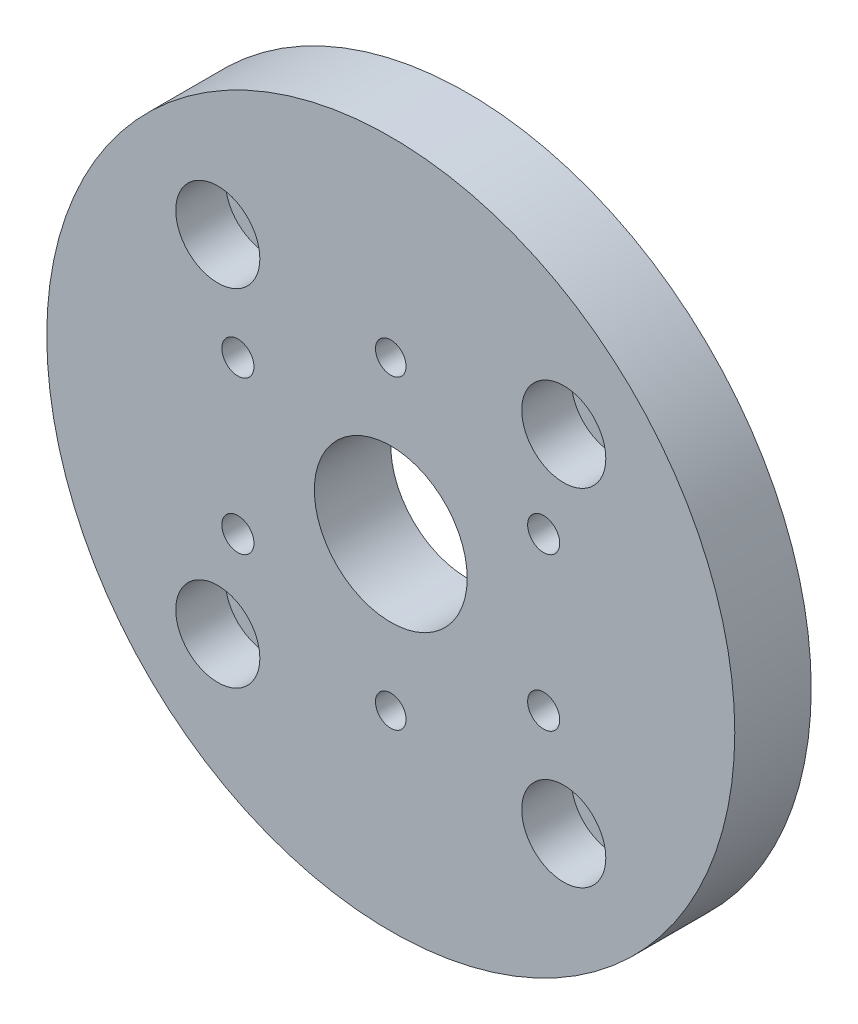
ISO-10303-21;
HEADER;
FILE_DESCRIPTION(('STEP AP214'),'2;1');
FILE_NAME('part.step','',(''),(''),'','','');
FILE_SCHEMA(('AUTOMOTIVE_DESIGN { 1 0 10303 214 1 1 1 1 }'));
ENDSEC;
DATA;
#1=APPLICATION_CONTEXT('core data for automotive mechanical design processes');
#2=APPLICATION_PROTOCOL_DEFINITION('international standard','automotive_design',2000,#1);
#3=PRODUCT_CONTEXT('',#1,'mechanical');
#4=PRODUCT('Part','Part','',(#3));
#5=PRODUCT_RELATED_PRODUCT_CATEGORY('part','',(#4));
#6=PRODUCT_DEFINITION_FORMATION('','',#4);
#7=PRODUCT_DEFINITION_CONTEXT('part definition',#1,'design');
#8=PRODUCT_DEFINITION('design','',#6,#7);
#9=PRODUCT_DEFINITION_SHAPE('','',#8);
#10=(LENGTH_UNIT() NAMED_UNIT(*) SI_UNIT(.MILLI.,.METRE.));
#11=(NAMED_UNIT(*) PLANE_ANGLE_UNIT() SI_UNIT($,.RADIAN.));
#12=(NAMED_UNIT(*) SI_UNIT($,.STERADIAN.) SOLID_ANGLE_UNIT());
#13=UNCERTAINTY_MEASURE_WITH_UNIT(LENGTH_MEASURE(1.E-05),#10,'distance_accuracy_value','');
#14=(GEOMETRIC_REPRESENTATION_CONTEXT(3) GLOBAL_UNCERTAINTY_ASSIGNED_CONTEXT((#13)) GLOBAL_UNIT_ASSIGNED_CONTEXT((#10,
#11,#12)) REPRESENTATION_CONTEXT('',''));
#15=CARTESIAN_POINT('',(0.,0.,0.));
#16=DIRECTION('',(0.,0.,1.));
#17=DIRECTION('',(1.,0.,0.));
#18=AXIS2_PLACEMENT_3D('',#15,#16,#17);
#19=CARTESIAN_POINT('',(22.62741699797,22.62741699797,3.5));
#20=DIRECTION('',(0.,0.,1.));
#21=DIRECTION('',(1.,0.,0.));
#22=AXIS2_PLACEMENT_3D('',#19,#20,#21);
#23=PLANE('',#22);
#24=CARTESIAN_POINT('',(22.62741699797,22.62741699797,3.5));
#25=DIRECTION('',(0.,0.,1.));
#26=DIRECTION('',(1.,0.,0.));
#27=AXIS2_PLACEMENT_3D('',#24,#25,#26);
#28=CIRCLE('',#27,3.3);
#29=CARTESIAN_POINT('',(25.92741699797,22.62741699797,3.5));
#30=VERTEX_POINT('',#29);
#31=EDGE_CURVE('E10',#30,#30,#28,.T.);
#32=ORIENTED_EDGE('',*,*,#31,.F.);
#33=EDGE_LOOP('',(#32));
#34=FACE_BOUND('',#33,.T.);
#35=CARTESIAN_POINT('',(22.62741699797,22.62741699797,3.5));
#36=DIRECTION('',(0.,0.,1.));
#37=DIRECTION('',(1.,0.,0.));
#38=AXIS2_PLACEMENT_3D('',#35,#36,#37);
#39=CIRCLE('',#38,5.5);
#40=CARTESIAN_POINT('',(28.12741699797,22.62741699797,3.5));
#41=VERTEX_POINT('',#40);
#42=EDGE_CURVE('E246',#41,#41,#39,.T.);
#43=ORIENTED_EDGE('',*,*,#42,.T.);
#44=EDGE_LOOP('',(#43));
#45=FACE_BOUND('',#44,.T.);
#46=ADVANCED_FACE('F17',(#34,#45),#23,.T.);
#47=CARTESIAN_POINT('',(-22.62741699797,22.62741699797,3.5));
#48=DIRECTION('',(0.,0.,1.));
#49=DIRECTION('',(1.,0.,0.));
#50=AXIS2_PLACEMENT_3D('',#47,#48,#49);
#51=PLANE('',#50);
#52=CARTESIAN_POINT('',(-22.62741699797,22.62741699797,3.5));
#53=DIRECTION('',(0.,0.,1.));
#54=DIRECTION('',(1.,0.,0.));
#55=AXIS2_PLACEMENT_3D('',#52,#53,#54);
#56=CIRCLE('',#55,3.3);
#57=CARTESIAN_POINT('',(-19.32741699797,22.62741699797,3.5));
#58=VERTEX_POINT('',#57);
#59=EDGE_CURVE('E44',#58,#58,#56,.T.);
#60=ORIENTED_EDGE('',*,*,#59,.F.);
#61=EDGE_LOOP('',(#60));
#62=FACE_BOUND('',#61,.T.);
#63=CARTESIAN_POINT('',(-22.62741699797,22.62741699797,3.5));
#64=DIRECTION('',(0.,0.,1.));
#65=DIRECTION('',(1.,0.,0.));
#66=AXIS2_PLACEMENT_3D('',#63,#64,#65);
#67=CIRCLE('',#66,5.5);
#68=CARTESIAN_POINT('',(-17.12741699797,22.62741699797,3.5));
#69=VERTEX_POINT('',#68);
#70=EDGE_CURVE('E241',#69,#69,#67,.T.);
#71=ORIENTED_EDGE('',*,*,#70,.T.);
#72=EDGE_LOOP('',(#71));
#73=FACE_BOUND('',#72,.T.);
#74=ADVANCED_FACE('F382',(#62,#73),#51,.T.);
#75=CARTESIAN_POINT('',(22.62741699797,-22.62741699797,3.5));
#76=DIRECTION('',(0.,0.,1.));
#77=DIRECTION('',(1.,0.,0.));
#78=AXIS2_PLACEMENT_3D('',#75,#76,#77);
#79=PLANE('',#78);
#80=CARTESIAN_POINT('',(22.62741699797,-22.62741699797,3.5));
#81=DIRECTION('',(0.,0.,1.));
#82=DIRECTION('',(1.,0.,0.));
#83=AXIS2_PLACEMENT_3D('',#80,#81,#82);
#84=CIRCLE('',#83,3.3);
#85=CARTESIAN_POINT('',(25.92741699797,-22.62741699797,3.5));
#86=VERTEX_POINT('',#85);
#87=EDGE_CURVE('E257',#86,#86,#84,.T.);
#88=ORIENTED_EDGE('',*,*,#87,.F.);
#89=EDGE_LOOP('',(#88));
#90=FACE_BOUND('',#89,.T.);
#91=CARTESIAN_POINT('',(22.62741699797,-22.62741699797,3.5));
#92=DIRECTION('',(0.,0.,1.));
#93=DIRECTION('',(1.,0.,0.));
#94=AXIS2_PLACEMENT_3D('',#91,#92,#93);
#95=CIRCLE('',#94,5.5);
#96=CARTESIAN_POINT('',(28.12741699797,-22.62741699797,3.5));
#97=VERTEX_POINT('',#96);
#98=EDGE_CURVE('E207',#97,#97,#95,.T.);
#99=ORIENTED_EDGE('',*,*,#98,.T.);
#100=EDGE_LOOP('',(#99));
#101=FACE_BOUND('',#100,.T.);
#102=ADVANCED_FACE('F378',(#90,#101),#79,.T.);
#103=CARTESIAN_POINT('',(-22.62741699797,-22.62741699797,3.5));
#104=DIRECTION('',(0.,0.,1.));
#105=DIRECTION('',(1.,0.,0.));
#106=AXIS2_PLACEMENT_3D('',#103,#104,#105);
#107=PLANE('',#106);
#108=CARTESIAN_POINT('',(-22.62741699797,-22.62741699797,3.5));
#109=DIRECTION('',(0.,0.,1.));
#110=DIRECTION('',(1.,0.,0.));
#111=AXIS2_PLACEMENT_3D('',#108,#109,#110);
#112=CIRCLE('',#111,3.3);
#113=CARTESIAN_POINT('',(-19.32741699797,-22.62741699797,3.5));
#114=VERTEX_POINT('',#113);
#115=EDGE_CURVE('E250',#114,#114,#112,.T.);
#116=ORIENTED_EDGE('',*,*,#115,.F.);
#117=EDGE_LOOP('',(#116));
#118=FACE_BOUND('',#117,.T.);
#119=CARTESIAN_POINT('',(-22.62741699797,-22.62741699797,3.5));
#120=DIRECTION('',(0.,0.,1.));
#121=DIRECTION('',(1.,0.,0.));
#122=AXIS2_PLACEMENT_3D('',#119,#120,#121);
#123=CIRCLE('',#122,5.5);
#124=CARTESIAN_POINT('',(-17.12741699797,-22.62741699797,3.5));
#125=VERTEX_POINT('',#124);
#126=EDGE_CURVE('E184',#125,#125,#123,.T.);
#127=ORIENTED_EDGE('',*,*,#126,.T.);
#128=EDGE_LOOP('',(#127));
#129=FACE_BOUND('',#128,.T.);
#130=ADVANCED_FACE('F381',(#118,#129),#107,.T.);
#131=CARTESIAN_POINT('',(22.62741699797,22.62741699797,-1.));
#132=DIRECTION('',(0.,0.,1.));
#133=DIRECTION('',(1.,0.,0.));
#134=AXIS2_PLACEMENT_3D('',#131,#132,#133);
#135=CYLINDRICAL_SURFACE('',#134,3.3);
#136=DIRECTION('',(0.,0.,1.));
#137=VECTOR('',#136,1.);
#138=CARTESIAN_POINT('',(25.92741699797,22.62741699797,-1.));
#139=LINE('',#138,#137);
#140=CARTESIAN_POINT('',(25.92741699797,22.62741699797,0.));
#141=VERTEX_POINT('',#140);
#142=EDGE_CURVE('E25',#141,#30,#139,.T.);
#143=ORIENTED_EDGE('',*,*,#142,.F.);
#144=CARTESIAN_POINT('',(22.62741699797,22.62741699797,0.));
#145=DIRECTION('',(0.,0.,1.));
#146=DIRECTION('',(1.,0.,0.));
#147=AXIS2_PLACEMENT_3D('',#144,#145,#146);
#148=CIRCLE('',#147,3.3);
#149=EDGE_CURVE('E223',#141,#141,#148,.T.);
#150=ORIENTED_EDGE('',*,*,#149,.F.);
#151=ORIENTED_EDGE('',*,*,#142,.T.);
#152=ORIENTED_EDGE('',*,*,#31,.T.);
#153=EDGE_LOOP('',(#143,#150,#151,#152));
#154=FACE_BOUND('',#153,.T.);
#155=ADVANCED_FACE('F266',(#154),#135,.F.);
#156=CARTESIAN_POINT('',(-22.62741699797,22.62741699797,-1.));
#157=DIRECTION('',(0.,0.,1.));
#158=DIRECTION('',(1.,0.,0.));
#159=AXIS2_PLACEMENT_3D('',#156,#157,#158);
#160=CYLINDRICAL_SURFACE('',#159,3.3);
#161=DIRECTION('',(0.,0.,1.));
#162=VECTOR('',#161,1.);
#163=CARTESIAN_POINT('',(-19.32741699797,22.62741699797,-1.));
#164=LINE('',#163,#162);
#165=CARTESIAN_POINT('',(-19.32741699797,22.62741699797,0.));
#166=VERTEX_POINT('',#165);
#167=EDGE_CURVE('E260',#166,#58,#164,.T.);
#168=ORIENTED_EDGE('',*,*,#167,.F.);
#169=CARTESIAN_POINT('',(-22.62741699797,22.62741699797,0.));
#170=DIRECTION('',(0.,0.,1.));
#171=DIRECTION('',(1.,0.,0.));
#172=AXIS2_PLACEMENT_3D('',#169,#170,#171);
#173=CIRCLE('',#172,3.3);
#174=EDGE_CURVE('E201',#166,#166,#173,.T.);
#175=ORIENTED_EDGE('',*,*,#174,.F.);
#176=ORIENTED_EDGE('',*,*,#167,.T.);
#177=ORIENTED_EDGE('',*,*,#59,.T.);
#178=EDGE_LOOP('',(#168,#175,#176,#177));
#179=FACE_BOUND('',#178,.T.);
#180=ADVANCED_FACE('F570',(#179),#160,.F.);
#181=CARTESIAN_POINT('',(22.62741699797,-22.62741699797,-1.));
#182=DIRECTION('',(0.,0.,1.));
#183=DIRECTION('',(1.,0.,0.));
#184=AXIS2_PLACEMENT_3D('',#181,#182,#183);
#185=CYLINDRICAL_SURFACE('',#184,3.3);
#186=DIRECTION('',(0.,0.,1.));
#187=VECTOR('',#186,1.);
#188=CARTESIAN_POINT('',(25.92741699797,-22.62741699797,-1.));
#189=LINE('',#188,#187);
#190=CARTESIAN_POINT('',(25.92741699797,-22.62741699797,0.));
#191=VERTEX_POINT('',#190);
#192=EDGE_CURVE('E253',#191,#86,#189,.T.);
#193=ORIENTED_EDGE('',*,*,#192,.F.);
#194=CARTESIAN_POINT('',(22.62741699797,-22.62741699797,0.));
#195=DIRECTION('',(0.,0.,1.));
#196=DIRECTION('',(1.,0.,0.));
#197=AXIS2_PLACEMENT_3D('',#194,#195,#196);
#198=CIRCLE('',#197,3.3);
#199=EDGE_CURVE('E318',#191,#191,#198,.T.);
#200=ORIENTED_EDGE('',*,*,#199,.F.);
#201=ORIENTED_EDGE('',*,*,#192,.T.);
#202=ORIENTED_EDGE('',*,*,#87,.T.);
#203=EDGE_LOOP('',(#193,#200,#201,#202));
#204=FACE_BOUND('',#203,.T.);
#205=ADVANCED_FACE('F375',(#204),#185,.F.);
#206=CARTESIAN_POINT('',(-22.62741699797,-22.62741699797,-1.));
#207=DIRECTION('',(0.,0.,1.));
#208=DIRECTION('',(1.,0.,0.));
#209=AXIS2_PLACEMENT_3D('',#206,#207,#208);
#210=CYLINDRICAL_SURFACE('',#209,3.3);
#211=DIRECTION('',(0.,0.,1.));
#212=VECTOR('',#211,1.);
#213=CARTESIAN_POINT('',(-19.32741699797,-22.62741699797,-1.));
#214=LINE('',#213,#212);
#215=CARTESIAN_POINT('',(-19.32741699797,-22.62741699797,0.));
#216=VERTEX_POINT('',#215);
#217=EDGE_CURVE('E249',#216,#114,#214,.T.);
#218=ORIENTED_EDGE('',*,*,#217,.F.);
#219=CARTESIAN_POINT('',(-22.62741699797,-22.62741699797,0.));
#220=DIRECTION('',(0.,0.,1.));
#221=DIRECTION('',(1.,0.,0.));
#222=AXIS2_PLACEMENT_3D('',#219,#220,#221);
#223=CIRCLE('',#222,3.3);
#224=EDGE_CURVE('E192',#216,#216,#223,.T.);
#225=ORIENTED_EDGE('',*,*,#224,.F.);
#226=ORIENTED_EDGE('',*,*,#217,.T.);
#227=ORIENTED_EDGE('',*,*,#115,.T.);
#228=EDGE_LOOP('',(#218,#225,#226,#227));
#229=FACE_BOUND('',#228,.T.);
#230=ADVANCED_FACE('F560',(#229),#210,.F.);
#231=CARTESIAN_POINT('',(22.62741699797,22.62741699797,3.5));
#232=DIRECTION('',(0.,0.,1.));
#233=DIRECTION('',(1.,0.,0.));
#234=AXIS2_PLACEMENT_3D('',#231,#232,#233);
#235=CYLINDRICAL_SURFACE('',#234,5.5);
#236=DIRECTION('',(0.,0.,1.));
#237=VECTOR('',#236,1.);
#238=CARTESIAN_POINT('',(28.12741699797,22.62741699797,3.5));
#239=LINE('',#238,#237);
#240=CARTESIAN_POINT('',(28.12741699797,22.62741699797,10.));
#241=VERTEX_POINT('',#240);
#242=EDGE_CURVE('E227',#41,#241,#239,.T.);
#243=ORIENTED_EDGE('',*,*,#242,.F.);
#244=ORIENTED_EDGE('',*,*,#42,.F.);
#245=ORIENTED_EDGE('',*,*,#242,.T.);
#246=CARTESIAN_POINT('',(22.62741699797,22.62741699797,10.));
#247=DIRECTION('',(0.,0.,1.));
#248=DIRECTION('',(1.,0.,0.));
#249=AXIS2_PLACEMENT_3D('',#246,#247,#248);
#250=CIRCLE('',#249,5.5);
#251=EDGE_CURVE('E196',#241,#241,#250,.T.);
#252=ORIENTED_EDGE('',*,*,#251,.T.);
#253=EDGE_LOOP('',(#243,#244,#245,#252));
#254=FACE_BOUND('',#253,.T.);
#255=ADVANCED_FACE('F557',(#254),#235,.F.);
#256=CARTESIAN_POINT('',(20.,10.,-1.));
#257=DIRECTION('',(0.,0.,1.));
#258=DIRECTION('',(1.,0.,0.));
#259=AXIS2_PLACEMENT_3D('',#256,#257,#258);
#260=CYLINDRICAL_SURFACE('',#259,2.1);
#261=DIRECTION('',(0.,0.,1.));
#262=VECTOR('',#261,1.);
#263=CARTESIAN_POINT('',(22.1,10.,-1.));
#264=LINE('',#263,#262);
#265=CARTESIAN_POINT('',(22.1,10.,0.));
#266=VERTEX_POINT('',#265);
#267=CARTESIAN_POINT('',(22.1,10.,10.));
#268=VERTEX_POINT('',#267);
#269=EDGE_CURVE('E224',#266,#268,#264,.T.);
#270=ORIENTED_EDGE('',*,*,#269,.F.);
#271=CARTESIAN_POINT('',(20.,10.,0.));
#272=DIRECTION('',(0.,0.,1.));
#273=DIRECTION('',(1.,0.,0.));
#274=AXIS2_PLACEMENT_3D('',#271,#272,#273);
#275=CIRCLE('',#274,2.1);
#276=EDGE_CURVE('E215',#266,#266,#275,.T.);
#277=ORIENTED_EDGE('',*,*,#276,.F.);
#278=ORIENTED_EDGE('',*,*,#269,.T.);
#279=CARTESIAN_POINT('',(20.,10.,10.));
#280=DIRECTION('',(0.,0.,1.));
#281=DIRECTION('',(1.,0.,0.));
#282=AXIS2_PLACEMENT_3D('',#279,#280,#281);
#283=CIRCLE('',#282,2.1);
#284=EDGE_CURVE('E304',#268,#268,#283,.T.);
#285=ORIENTED_EDGE('',*,*,#284,.T.);
#286=EDGE_LOOP('',(#270,#277,#278,#285));
#287=FACE_BOUND('',#286,.T.);
#288=ADVANCED_FACE('F329',(#287),#260,.F.);
#289=CARTESIAN_POINT('',(0.,20.,-1.));
#290=DIRECTION('',(0.,0.,1.));
#291=DIRECTION('',(1.,0.,0.));
#292=AXIS2_PLACEMENT_3D('',#289,#290,#291);
#293=CYLINDRICAL_SURFACE('',#292,2.);
#294=DIRECTION('',(0.,0.,1.));
#295=VECTOR('',#294,1.);
#296=CARTESIAN_POINT('',(2.,20.,-1.));
#297=LINE('',#296,#295);
#298=CARTESIAN_POINT('',(2.,20.,0.));
#299=VERTEX_POINT('',#298);
#300=CARTESIAN_POINT('',(2.,20.,10.));
#301=VERTEX_POINT('',#300);
#302=EDGE_CURVE('E228',#299,#301,#297,.T.);
#303=ORIENTED_EDGE('',*,*,#302,.F.);
#304=CARTESIAN_POINT('',(0.,20.,0.));
#305=DIRECTION('',(0.,0.,1.));
#306=DIRECTION('',(1.,0.,0.));
#307=AXIS2_PLACEMENT_3D('',#304,#305,#306);
#308=CIRCLE('',#307,2.);
#309=EDGE_CURVE('E219',#299,#299,#308,.T.);
#310=ORIENTED_EDGE('',*,*,#309,.F.);
#311=ORIENTED_EDGE('',*,*,#302,.T.);
#312=CARTESIAN_POINT('',(0.,20.,10.));
#313=DIRECTION('',(0.,0.,1.));
#314=DIRECTION('',(1.,0.,0.));
#315=AXIS2_PLACEMENT_3D('',#312,#313,#314);
#316=CIRCLE('',#315,2.);
#317=EDGE_CURVE('E309',#301,#301,#316,.T.);
#318=ORIENTED_EDGE('',*,*,#317,.T.);
#319=EDGE_LOOP('',(#303,#310,#311,#318));
#320=FACE_BOUND('',#319,.T.);
#321=ADVANCED_FACE('F565',(#320),#293,.F.);
#322=CARTESIAN_POINT('',(-22.62741699797,22.62741699797,3.5));
#323=DIRECTION('',(0.,0.,1.));
#324=DIRECTION('',(1.,0.,0.));
#325=AXIS2_PLACEMENT_3D('',#322,#323,#324);
#326=CYLINDRICAL_SURFACE('',#325,5.5);
#327=DIRECTION('',(0.,0.,1.));
#328=VECTOR('',#327,1.);
#329=CARTESIAN_POINT('',(-17.12741699797,22.62741699797,3.5));
#330=LINE('',#329,#328);
#331=CARTESIAN_POINT('',(-17.12741699797,22.62741699797,10.));
#332=VERTEX_POINT('',#331);
#333=EDGE_CURVE('E238',#69,#332,#330,.T.);
#334=ORIENTED_EDGE('',*,*,#333,.F.);
#335=ORIENTED_EDGE('',*,*,#70,.F.);
#336=ORIENTED_EDGE('',*,*,#333,.T.);
#337=CARTESIAN_POINT('',(-22.62741699797,22.62741699797,10.));
#338=DIRECTION('',(0.,0.,1.));
#339=DIRECTION('',(1.,0.,0.));
#340=AXIS2_PLACEMENT_3D('',#337,#338,#339);
#341=CIRCLE('',#340,5.5);
#342=EDGE_CURVE('E305',#332,#332,#341,.T.);
#343=ORIENTED_EDGE('',*,*,#342,.T.);
#344=EDGE_LOOP('',(#334,#335,#336,#343));
#345=FACE_BOUND('',#344,.T.);
#346=ADVANCED_FACE('F545',(#345),#326,.F.);
#347=CARTESIAN_POINT('',(-20.,10.,-1.));
#348=DIRECTION('',(0.,0.,1.));
#349=DIRECTION('',(1.,0.,0.));
#350=AXIS2_PLACEMENT_3D('',#347,#348,#349);
#351=CYLINDRICAL_SURFACE('',#350,2.1);
#352=DIRECTION('',(0.,0.,1.));
#353=VECTOR('',#352,1.);
#354=CARTESIAN_POINT('',(-17.9,10.,-1.));
#355=LINE('',#354,#353);
#356=CARTESIAN_POINT('',(-17.9,10.,0.));
#357=VERTEX_POINT('',#356);
#358=CARTESIAN_POINT('',(-17.9,10.,10.));
#359=VERTEX_POINT('',#358);
#360=EDGE_CURVE('E206',#357,#359,#355,.T.);
#361=ORIENTED_EDGE('',*,*,#360,.F.);
#362=CARTESIAN_POINT('',(-20.,10.,0.));
#363=DIRECTION('',(0.,0.,1.));
#364=DIRECTION('',(1.,0.,0.));
#365=AXIS2_PLACEMENT_3D('',#362,#363,#364);
#366=CIRCLE('',#365,2.1);
#367=EDGE_CURVE('E197',#357,#357,#366,.T.);
#368=ORIENTED_EDGE('',*,*,#367,.F.);
#369=ORIENTED_EDGE('',*,*,#360,.T.);
#370=CARTESIAN_POINT('',(-20.,10.,10.));
#371=DIRECTION('',(0.,0.,1.));
#372=DIRECTION('',(1.,0.,0.));
#373=AXIS2_PLACEMENT_3D('',#370,#371,#372);
#374=CIRCLE('',#373,2.1);
#375=EDGE_CURVE('E276',#359,#359,#374,.T.);
#376=ORIENTED_EDGE('',*,*,#375,.T.);
#377=EDGE_LOOP('',(#361,#368,#369,#376));
#378=FACE_BOUND('',#377,.T.);
#379=ADVANCED_FACE('F527',(#378),#351,.F.);
#380=CARTESIAN_POINT('',(20.,-10.,-1.));
#381=DIRECTION('',(0.,0.,1.));
#382=DIRECTION('',(1.,0.,0.));
#383=AXIS2_PLACEMENT_3D('',#380,#381,#382);
#384=CYLINDRICAL_SURFACE('',#383,2.1);
#385=DIRECTION('',(0.,0.,1.));
#386=VECTOR('',#385,1.);
#387=CARTESIAN_POINT('',(22.1,-10.,-1.));
#388=LINE('',#387,#386);
#389=CARTESIAN_POINT('',(22.1,-10.,0.));
#390=VERTEX_POINT('',#389);
#391=CARTESIAN_POINT('',(22.1,-10.,10.));
#392=VERTEX_POINT('',#391);
#393=EDGE_CURVE('E203',#390,#392,#388,.T.);
#394=ORIENTED_EDGE('',*,*,#393,.F.);
#395=CARTESIAN_POINT('',(20.,-10.,0.));
#396=DIRECTION('',(0.,0.,1.));
#397=DIRECTION('',(1.,0.,0.));
#398=AXIS2_PLACEMENT_3D('',#395,#396,#397);
#399=CIRCLE('',#398,2.1);
#400=EDGE_CURVE('E202',#390,#390,#399,.T.);
#401=ORIENTED_EDGE('',*,*,#400,.F.);
#402=ORIENTED_EDGE('',*,*,#393,.T.);
#403=CARTESIAN_POINT('',(20.,-10.,10.));
#404=DIRECTION('',(0.,0.,1.));
#405=DIRECTION('',(1.,0.,0.));
#406=AXIS2_PLACEMENT_3D('',#403,#404,#405);
#407=CIRCLE('',#406,2.1);
#408=EDGE_CURVE('E291',#392,#392,#407,.T.);
#409=ORIENTED_EDGE('',*,*,#408,.T.);
#410=EDGE_LOOP('',(#394,#401,#402,#409));
#411=FACE_BOUND('',#410,.T.);
#412=ADVANCED_FACE('F536',(#411),#384,.F.);
#413=CARTESIAN_POINT('',(22.62741699797,-22.62741699797,3.5));
#414=DIRECTION('',(0.,0.,1.));
#415=DIRECTION('',(1.,0.,0.));
#416=AXIS2_PLACEMENT_3D('',#413,#414,#415);
#417=CYLINDRICAL_SURFACE('',#416,5.5);
#418=DIRECTION('',(0.,0.,1.));
#419=VECTOR('',#418,1.);
#420=CARTESIAN_POINT('',(28.12741699797,-22.62741699797,3.5));
#421=LINE('',#420,#419);
#422=CARTESIAN_POINT('',(28.12741699797,-22.62741699797,10.));
#423=VERTEX_POINT('',#422);
#424=EDGE_CURVE('E181',#97,#423,#421,.T.);
#425=ORIENTED_EDGE('',*,*,#424,.F.);
#426=ORIENTED_EDGE('',*,*,#98,.F.);
#427=ORIENTED_EDGE('',*,*,#424,.T.);
#428=CARTESIAN_POINT('',(22.62741699797,-22.62741699797,10.));
#429=DIRECTION('',(0.,0.,1.));
#430=DIRECTION('',(1.,0.,0.));
#431=AXIS2_PLACEMENT_3D('',#428,#429,#430);
#432=CIRCLE('',#431,5.5);
#433=EDGE_CURVE('E287',#423,#423,#432,.T.);
#434=ORIENTED_EDGE('',*,*,#433,.T.);
#435=EDGE_LOOP('',(#425,#426,#427,#434));
#436=FACE_BOUND('',#435,.T.);
#437=ADVANCED_FACE('F387',(#436),#417,.F.);
#438=CARTESIAN_POINT('',(0.,0.,-1.));
#439=DIRECTION('',(0.,0.,1.));
#440=DIRECTION('',(1.,0.,0.));
#441=AXIS2_PLACEMENT_3D('',#438,#439,#440);
#442=CYLINDRICAL_SURFACE('',#441,10.);
#443=DIRECTION('',(0.,0.,1.));
#444=VECTOR('',#443,1.);
#445=CARTESIAN_POINT('',(10.,0.,-1.));
#446=LINE('',#445,#444);
#447=CARTESIAN_POINT('',(10.,0.,0.));
#448=VERTEX_POINT('',#447);
#449=CARTESIAN_POINT('',(10.,0.,10.));
#450=VERTEX_POINT('',#449);
#451=EDGE_CURVE('E173',#448,#450,#446,.T.);
#452=ORIENTED_EDGE('',*,*,#451,.F.);
#453=CARTESIAN_POINT('',(0.,0.,0.));
#454=DIRECTION('',(0.,0.,1.));
#455=DIRECTION('',(1.,0.,0.));
#456=AXIS2_PLACEMENT_3D('',#453,#454,#455);
#457=CIRCLE('',#456,10.);
#458=EDGE_CURVE('E211',#448,#448,#457,.T.);
#459=ORIENTED_EDGE('',*,*,#458,.F.);
#460=ORIENTED_EDGE('',*,*,#451,.T.);
#461=CARTESIAN_POINT('',(0.,0.,10.));
#462=DIRECTION('',(0.,0.,1.));
#463=DIRECTION('',(1.,0.,0.));
#464=AXIS2_PLACEMENT_3D('',#461,#462,#463);
#465=CIRCLE('',#464,10.);
#466=EDGE_CURVE('E292',#450,#450,#465,.T.);
#467=ORIENTED_EDGE('',*,*,#466,.T.);
#468=EDGE_LOOP('',(#452,#459,#460,#467));
#469=FACE_BOUND('',#468,.T.);
#470=ADVANCED_FACE('F543',(#469),#442,.F.);
#471=CARTESIAN_POINT('',(-20.,-10.,-1.));
#472=DIRECTION('',(0.,0.,1.));
#473=DIRECTION('',(1.,0.,0.));
#474=AXIS2_PLACEMENT_3D('',#471,#472,#473);
#475=CYLINDRICAL_SURFACE('',#474,2.1);
#476=DIRECTION('',(0.,0.,1.));
#477=VECTOR('',#476,1.);
#478=CARTESIAN_POINT('',(-17.9,-10.,-1.));
#479=LINE('',#478,#477);
#480=CARTESIAN_POINT('',(-17.9,-10.,0.));
#481=VERTEX_POINT('',#480);
#482=CARTESIAN_POINT('',(-17.9,-10.,10.));
#483=VERTEX_POINT('',#482);
#484=EDGE_CURVE('E166',#481,#483,#479,.T.);
#485=ORIENTED_EDGE('',*,*,#484,.F.);
#486=CARTESIAN_POINT('',(-20.,-10.,0.));
#487=DIRECTION('',(0.,0.,1.));
#488=DIRECTION('',(1.,0.,0.));
#489=AXIS2_PLACEMENT_3D('',#486,#487,#488);
#490=CIRCLE('',#489,2.1);
#491=EDGE_CURVE('E171',#481,#481,#490,.T.);
#492=ORIENTED_EDGE('',*,*,#491,.F.);
#493=ORIENTED_EDGE('',*,*,#484,.T.);
#494=CARTESIAN_POINT('',(-20.,-10.,10.));
#495=DIRECTION('',(0.,0.,1.));
#496=DIRECTION('',(1.,0.,0.));
#497=AXIS2_PLACEMENT_3D('',#494,#495,#496);
#498=CIRCLE('',#497,2.1);
#499=EDGE_CURVE('E169',#483,#483,#498,.T.);
#500=ORIENTED_EDGE('',*,*,#499,.T.);
#501=EDGE_LOOP('',(#485,#492,#493,#500));
#502=FACE_BOUND('',#501,.T.);
#503=ADVANCED_FACE('F167',(#502),#475,.F.);
#504=CARTESIAN_POINT('',(0.,-20.,-1.));
#505=DIRECTION('',(0.,0.,1.));
#506=DIRECTION('',(1.,0.,0.));
#507=AXIS2_PLACEMENT_3D('',#504,#505,#506);
#508=CYLINDRICAL_SURFACE('',#507,2.);
#509=DIRECTION('',(0.,0.,1.));
#510=VECTOR('',#509,1.);
#511=CARTESIAN_POINT('',(2.,-20.,-1.));
#512=LINE('',#511,#510);
#513=CARTESIAN_POINT('',(2.,-20.,0.));
#514=VERTEX_POINT('',#513);
#515=CARTESIAN_POINT('',(2.,-20.,10.));
#516=VERTEX_POINT('',#515);
#517=EDGE_CURVE('E174',#514,#516,#512,.T.);
#518=ORIENTED_EDGE('',*,*,#517,.F.);
#519=CARTESIAN_POINT('',(0.,-20.,0.));
#520=DIRECTION('',(0.,0.,1.));
#521=DIRECTION('',(1.,0.,0.));
#522=AXIS2_PLACEMENT_3D('',#519,#520,#521);
#523=CIRCLE('',#522,2.);
#524=EDGE_CURVE('E191',#514,#514,#523,.T.);
#525=ORIENTED_EDGE('',*,*,#524,.F.);
#526=ORIENTED_EDGE('',*,*,#517,.T.);
#527=CARTESIAN_POINT('',(0.,-20.,10.));
#528=DIRECTION('',(0.,0.,1.));
#529=DIRECTION('',(1.,0.,0.));
#530=AXIS2_PLACEMENT_3D('',#527,#528,#529);
#531=CIRCLE('',#530,2.);
#532=EDGE_CURVE('E283',#516,#516,#531,.T.);
#533=ORIENTED_EDGE('',*,*,#532,.T.);
#534=EDGE_LOOP('',(#518,#525,#526,#533));
#535=FACE_BOUND('',#534,.T.);
#536=ADVANCED_FACE('F584',(#535),#508,.F.);
#537=CARTESIAN_POINT('',(-22.62741699797,-22.62741699797,3.5));
#538=DIRECTION('',(0.,0.,1.));
#539=DIRECTION('',(1.,0.,0.));
#540=AXIS2_PLACEMENT_3D('',#537,#538,#539);
#541=CYLINDRICAL_SURFACE('',#540,5.5);
#542=DIRECTION('',(0.,0.,1.));
#543=VECTOR('',#542,1.);
#544=CARTESIAN_POINT('',(-17.12741699797,-22.62741699797,3.5));
#545=LINE('',#544,#543);
#546=CARTESIAN_POINT('',(-17.12741699797,-22.62741699797,10.));
#547=VERTEX_POINT('',#546);
#548=EDGE_CURVE('E229',#125,#547,#545,.T.);
#549=ORIENTED_EDGE('',*,*,#548,.F.);
#550=ORIENTED_EDGE('',*,*,#126,.F.);
#551=ORIENTED_EDGE('',*,*,#548,.T.);
#552=CARTESIAN_POINT('',(-22.62741699797,-22.62741699797,10.));
#553=DIRECTION('',(0.,0.,1.));
#554=DIRECTION('',(1.,0.,0.));
#555=AXIS2_PLACEMENT_3D('',#552,#553,#554);
#556=CIRCLE('',#555,5.5);
#557=EDGE_CURVE('E281',#547,#547,#556,.T.);
#558=ORIENTED_EDGE('',*,*,#557,.T.);
#559=EDGE_LOOP('',(#549,#550,#551,#558));
#560=FACE_BOUND('',#559,.T.);
#561=ADVANCED_FACE('F532',(#560),#541,.F.);
#562=CARTESIAN_POINT('',(0.,0.,0.));
#563=DIRECTION('',(0.,0.,1.));
#564=DIRECTION('',(1.,0.,0.));
#565=AXIS2_PLACEMENT_3D('',#562,#563,#564);
#566=PLANE('',#565);
#567=ORIENTED_EDGE('',*,*,#149,.T.);
#568=EDGE_LOOP('',(#567));
#569=FACE_BOUND('',#568,.T.);
#570=ORIENTED_EDGE('',*,*,#309,.T.);
#571=EDGE_LOOP('',(#570));
#572=FACE_BOUND('',#571,.T.);
#573=ORIENTED_EDGE('',*,*,#276,.T.);
#574=EDGE_LOOP('',(#573));
#575=FACE_BOUND('',#574,.T.);
#576=ORIENTED_EDGE('',*,*,#458,.T.);
#577=EDGE_LOOP('',(#576));
#578=FACE_BOUND('',#577,.T.);
#579=ORIENTED_EDGE('',*,*,#174,.T.);
#580=EDGE_LOOP('',(#579));
#581=FACE_BOUND('',#580,.T.);
#582=ORIENTED_EDGE('',*,*,#367,.T.);
#583=EDGE_LOOP('',(#582));
#584=FACE_BOUND('',#583,.T.);
#585=ORIENTED_EDGE('',*,*,#400,.T.);
#586=EDGE_LOOP('',(#585));
#587=FACE_BOUND('',#586,.T.);
#588=ORIENTED_EDGE('',*,*,#199,.T.);
#589=EDGE_LOOP('',(#588));
#590=FACE_BOUND('',#589,.T.);
#591=ORIENTED_EDGE('',*,*,#524,.T.);
#592=EDGE_LOOP('',(#591));
#593=FACE_BOUND('',#592,.T.);
#594=ORIENTED_EDGE('',*,*,#491,.T.);
#595=EDGE_LOOP('',(#594));
#596=FACE_BOUND('',#595,.T.);
#597=ORIENTED_EDGE('',*,*,#224,.T.);
#598=EDGE_LOOP('',(#597));
#599=FACE_BOUND('',#598,.T.);
#600=CARTESIAN_POINT('',(0.,0.,0.));
#601=DIRECTION('',(0.,0.,1.));
#602=DIRECTION('',(1.,0.,0.));
#603=AXIS2_PLACEMENT_3D('',#600,#601,#602);
#604=CIRCLE('',#603,45.);
#605=CARTESIAN_POINT('',(45.,0.,0.));
#606=VERTEX_POINT('',#605);
#607=EDGE_CURVE('E278',#606,#606,#604,.T.);
#608=ORIENTED_EDGE('',*,*,#607,.F.);
#609=EDGE_LOOP('',(#608));
#610=FACE_BOUND('',#609,.T.);
#611=ADVANCED_FACE('F269',(#569,#572,#575,#578,#581,#584,#587,#590,#593,#596,#599,#610),#566,.F.);
#612=CARTESIAN_POINT('',(0.,0.,10.));
#613=DIRECTION('',(0.,0.,1.));
#614=DIRECTION('',(1.,0.,0.));
#615=AXIS2_PLACEMENT_3D('',#612,#613,#614);
#616=PLANE('',#615);
#617=ORIENTED_EDGE('',*,*,#251,.F.);
#618=EDGE_LOOP('',(#617));
#619=FACE_BOUND('',#618,.T.);
#620=ORIENTED_EDGE('',*,*,#284,.F.);
#621=EDGE_LOOP('',(#620));
#622=FACE_BOUND('',#621,.T.);
#623=ORIENTED_EDGE('',*,*,#317,.F.);
#624=EDGE_LOOP('',(#623));
#625=FACE_BOUND('',#624,.T.);
#626=ORIENTED_EDGE('',*,*,#342,.F.);
#627=EDGE_LOOP('',(#626));
#628=FACE_BOUND('',#627,.T.);
#629=ORIENTED_EDGE('',*,*,#375,.F.);
#630=EDGE_LOOP('',(#629));
#631=FACE_BOUND('',#630,.T.);
#632=ORIENTED_EDGE('',*,*,#408,.F.);
#633=EDGE_LOOP('',(#632));
#634=FACE_BOUND('',#633,.T.);
#635=ORIENTED_EDGE('',*,*,#433,.F.);
#636=EDGE_LOOP('',(#635));
#637=FACE_BOUND('',#636,.T.);
#638=ORIENTED_EDGE('',*,*,#466,.F.);
#639=EDGE_LOOP('',(#638));
#640=FACE_BOUND('',#639,.T.);
#641=ORIENTED_EDGE('',*,*,#499,.F.);
#642=EDGE_LOOP('',(#641));
#643=FACE_BOUND('',#642,.T.);
#644=ORIENTED_EDGE('',*,*,#532,.F.);
#645=EDGE_LOOP('',(#644));
#646=FACE_BOUND('',#645,.T.);
#647=ORIENTED_EDGE('',*,*,#557,.F.);
#648=EDGE_LOOP('',(#647));
#649=FACE_BOUND('',#648,.T.);
#650=CARTESIAN_POINT('',(0.,0.,10.));
#651=DIRECTION('',(0.,0.,1.));
#652=DIRECTION('',(1.,0.,0.));
#653=AXIS2_PLACEMENT_3D('',#650,#651,#652);
#654=CIRCLE('',#653,45.);
#655=CARTESIAN_POINT('',(45.,0.,10.));
#656=VERTEX_POINT('',#655);
#657=EDGE_CURVE('E359',#656,#656,#654,.T.);
#658=ORIENTED_EDGE('',*,*,#657,.T.);
#659=EDGE_LOOP('',(#658));
#660=FACE_BOUND('',#659,.T.);
#661=ADVANCED_FACE('F332',(#619,#622,#625,#628,#631,#634,#637,#640,#643,#646,#649,#660),#616,.T.);
#662=CARTESIAN_POINT('',(0.,0.,0.));
#663=DIRECTION('',(0.,0.,1.));
#664=DIRECTION('',(1.,0.,0.));
#665=AXIS2_PLACEMENT_3D('',#662,#663,#664);
#666=CYLINDRICAL_SURFACE('',#665,45.);
#667=ORIENTED_EDGE('',*,*,#657,.F.);
#668=DIRECTION('',(0.,0.,1.));
#669=VECTOR('',#668,1.);
#670=CARTESIAN_POINT('',(45.,0.,0.));
#671=LINE('',#670,#669);
#672=EDGE_CURVE('E282',#606,#656,#671,.T.);
#673=ORIENTED_EDGE('',*,*,#672,.F.);
#674=ORIENTED_EDGE('',*,*,#607,.T.);
#675=ORIENTED_EDGE('',*,*,#672,.T.);
#676=EDGE_LOOP('',(#667,#673,#674,#675));
#677=FACE_BOUND('',#676,.T.);
#678=ADVANCED_FACE('F335',(#677),#666,.T.);
#679=CLOSED_SHELL('',(#46,#74,#102,#130,#155,#180,#205,#230,#255,#288,#321,#346,#379,#412,#437,
#470,#503,#536,#561,#611,#661,#678));
#680=MANIFOLD_SOLID_BREP('B1',#679);
#681=ADVANCED_BREP_SHAPE_REPRESENTATION('',(#18,#680),#14);
#682=SHAPE_DEFINITION_REPRESENTATION(#9,#681);
ENDSEC;
END-ISO-10303-21;
